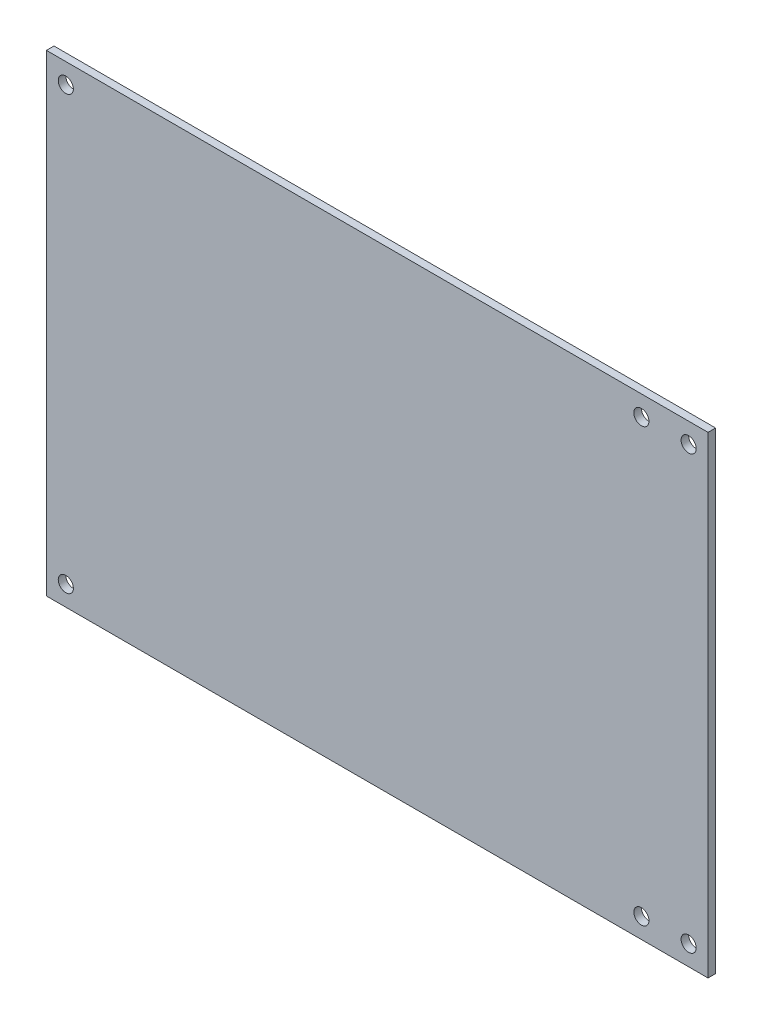
ISO-10303-21;
HEADER;
FILE_DESCRIPTION(('STEP AP214'),'2;1');
FILE_NAME('part.step','',(''),(''),'','','');
FILE_SCHEMA(('AUTOMOTIVE_DESIGN { 1 0 10303 214 1 1 1 1 }'));
ENDSEC;
DATA;
#1=APPLICATION_CONTEXT('core data for automotive mechanical design processes');
#2=APPLICATION_PROTOCOL_DEFINITION('international standard','automotive_design',2000,#1);
#3=PRODUCT_CONTEXT('',#1,'mechanical');
#4=PRODUCT('Part','Part','',(#3));
#5=PRODUCT_RELATED_PRODUCT_CATEGORY('part','',(#4));
#6=PRODUCT_DEFINITION_FORMATION('','',#4);
#7=PRODUCT_DEFINITION_CONTEXT('part definition',#1,'design');
#8=PRODUCT_DEFINITION('design','',#6,#7);
#9=PRODUCT_DEFINITION_SHAPE('','',#8);
#10=(LENGTH_UNIT() NAMED_UNIT(*) SI_UNIT(.MILLI.,.METRE.));
#11=(NAMED_UNIT(*) PLANE_ANGLE_UNIT() SI_UNIT($,.RADIAN.));
#12=(NAMED_UNIT(*) SI_UNIT($,.STERADIAN.) SOLID_ANGLE_UNIT());
#13=UNCERTAINTY_MEASURE_WITH_UNIT(LENGTH_MEASURE(1.E-05),#10,'distance_accuracy_value','');
#14=(GEOMETRIC_REPRESENTATION_CONTEXT(3) GLOBAL_UNCERTAINTY_ASSIGNED_CONTEXT((#13)) GLOBAL_UNIT_ASSIGNED_CONTEXT((#10,
#11,#12)) REPRESENTATION_CONTEXT('',''));
#15=CARTESIAN_POINT('',(0.,0.,0.));
#16=DIRECTION('',(0.,0.,1.));
#17=DIRECTION('',(1.,0.,0.));
#18=AXIS2_PLACEMENT_3D('',#15,#16,#17);
#19=CARTESIAN_POINT('',(70.,50.,1.6));
#20=DIRECTION('',(-1.,0.,0.));
#21=DIRECTION('',(0.,-1.,0.));
#22=AXIS2_PLACEMENT_3D('',#19,#20,#21);
#23=PLANE('',#22);
#24=DIRECTION('',(0.,1.,0.));
#25=VECTOR('',#24,1.);
#26=CARTESIAN_POINT('',(70.,50.,0.));
#27=LINE('',#26,#25);
#28=CARTESIAN_POINT('',(70.,-50.,0.));
#29=VERTEX_POINT('',#28);
#30=CARTESIAN_POINT('',(70.,50.,0.));
#31=VERTEX_POINT('',#30);
#32=EDGE_CURVE('E98',#29,#31,#27,.T.);
#33=ORIENTED_EDGE('',*,*,#32,.T.);
#34=DIRECTION('',(0.,0.,-1.));
#35=VECTOR('',#34,1.);
#36=CARTESIAN_POINT('',(70.,50.,1.6));
#37=LINE('',#36,#35);
#38=CARTESIAN_POINT('',(70.,50.,1.6));
#39=VERTEX_POINT('',#38);
#40=EDGE_CURVE('E11',#39,#31,#37,.T.);
#41=ORIENTED_EDGE('',*,*,#40,.F.);
#42=DIRECTION('',(0.,1.,0.));
#43=VECTOR('',#42,1.);
#44=CARTESIAN_POINT('',(70.,50.,1.6));
#45=LINE('',#44,#43);
#46=CARTESIAN_POINT('',(70.,-50.,1.6));
#47=VERTEX_POINT('',#46);
#48=EDGE_CURVE('E86',#47,#39,#45,.T.);
#49=ORIENTED_EDGE('',*,*,#48,.F.);
#50=DIRECTION('',(0.,0.,-1.));
#51=VECTOR('',#50,1.);
#52=CARTESIAN_POINT('',(70.,-50.,1.6));
#53=LINE('',#52,#51);
#54=EDGE_CURVE('E94',#47,#29,#53,.T.);
#55=ORIENTED_EDGE('',*,*,#54,.T.);
#56=EDGE_LOOP('',(#33,#41,#49,#55));
#57=FACE_BOUND('',#56,.T.);
#58=ADVANCED_FACE('F35',(#57),#23,.F.);
#59=CARTESIAN_POINT('',(-70.,50.,1.6));
#60=DIRECTION('',(0.,-1.,0.));
#61=DIRECTION('',(0.,0.,-1.));
#62=AXIS2_PLACEMENT_3D('',#59,#60,#61);
#63=PLANE('',#62);
#64=DIRECTION('',(-1.,0.,0.));
#65=VECTOR('',#64,1.);
#66=CARTESIAN_POINT('',(-70.,50.,0.));
#67=LINE('',#66,#65);
#68=CARTESIAN_POINT('',(-70.,50.,0.));
#69=VERTEX_POINT('',#68);
#70=EDGE_CURVE('E90',#31,#69,#67,.T.);
#71=ORIENTED_EDGE('',*,*,#70,.T.);
#72=DIRECTION('',(0.,0.,-1.));
#73=VECTOR('',#72,1.);
#74=CARTESIAN_POINT('',(-70.,50.,1.6));
#75=LINE('',#74,#73);
#76=CARTESIAN_POINT('',(-70.,50.,1.6));
#77=VERTEX_POINT('',#76);
#78=EDGE_CURVE('E43',#77,#69,#75,.T.);
#79=ORIENTED_EDGE('',*,*,#78,.F.);
#80=DIRECTION('',(-1.,0.,0.));
#81=VECTOR('',#80,1.);
#82=CARTESIAN_POINT('',(-70.,50.,1.6));
#83=LINE('',#82,#81);
#84=EDGE_CURVE('E81',#39,#77,#83,.T.);
#85=ORIENTED_EDGE('',*,*,#84,.F.);
#86=ORIENTED_EDGE('',*,*,#40,.T.);
#87=EDGE_LOOP('',(#71,#79,#85,#86));
#88=FACE_BOUND('',#87,.T.);
#89=ADVANCED_FACE('F89',(#88),#63,.F.);
#90=CARTESIAN_POINT('',(-70.,50.,1.6));
#91=DIRECTION('',(1.,0.,0.));
#92=DIRECTION('',(0.,1.,0.));
#93=AXIS2_PLACEMENT_3D('',#90,#91,#92);
#94=PLANE('',#93);
#95=DIRECTION('',(0.,-1.,0.));
#96=VECTOR('',#95,1.);
#97=CARTESIAN_POINT('',(-70.,50.,0.));
#98=LINE('',#97,#96);
#99=CARTESIAN_POINT('',(-70.,-50.,0.));
#100=VERTEX_POINT('',#99);
#101=EDGE_CURVE('E68',#69,#100,#98,.T.);
#102=ORIENTED_EDGE('',*,*,#101,.T.);
#103=DIRECTION('',(0.,0.,-1.));
#104=VECTOR('',#103,1.);
#105=CARTESIAN_POINT('',(-70.,-50.,1.6));
#106=LINE('',#105,#104);
#107=CARTESIAN_POINT('',(-70.,-50.,1.6));
#108=VERTEX_POINT('',#107);
#109=EDGE_CURVE('E91',#108,#100,#106,.T.);
#110=ORIENTED_EDGE('',*,*,#109,.F.);
#111=DIRECTION('',(0.,-1.,0.));
#112=VECTOR('',#111,1.);
#113=CARTESIAN_POINT('',(-70.,50.,1.6));
#114=LINE('',#113,#112);
#115=EDGE_CURVE('E84',#77,#108,#114,.T.);
#116=ORIENTED_EDGE('',*,*,#115,.F.);
#117=ORIENTED_EDGE('',*,*,#78,.T.);
#118=EDGE_LOOP('',(#102,#110,#116,#117));
#119=FACE_BOUND('',#118,.T.);
#120=ADVANCED_FACE('F92',(#119),#94,.F.);
#121=CARTESIAN_POINT('',(-70.,-50.,1.6));
#122=DIRECTION('',(0.,1.,0.));
#123=DIRECTION('',(0.,0.,1.));
#124=AXIS2_PLACEMENT_3D('',#121,#122,#123);
#125=PLANE('',#124);
#126=DIRECTION('',(1.,0.,0.));
#127=VECTOR('',#126,1.);
#128=CARTESIAN_POINT('',(-70.,-50.,0.));
#129=LINE('',#128,#127);
#130=EDGE_CURVE('E74',#100,#29,#129,.T.);
#131=ORIENTED_EDGE('',*,*,#130,.T.);
#132=ORIENTED_EDGE('',*,*,#54,.F.);
#133=DIRECTION('',(1.,0.,0.));
#134=VECTOR('',#133,1.);
#135=CARTESIAN_POINT('',(-70.,-50.,1.6));
#136=LINE('',#135,#134);
#137=EDGE_CURVE('E51',#108,#47,#136,.T.);
#138=ORIENTED_EDGE('',*,*,#137,.F.);
#139=ORIENTED_EDGE('',*,*,#109,.T.);
#140=EDGE_LOOP('',(#131,#132,#138,#139));
#141=FACE_BOUND('',#140,.T.);
#142=ADVANCED_FACE('F106',(#141),#125,.F.);
#143=CARTESIAN_POINT('',(0.,0.,1.6));
#144=DIRECTION('',(0.,0.,1.));
#145=DIRECTION('',(1.,0.,0.));
#146=AXIS2_PLACEMENT_3D('',#143,#144,#145);
#147=PLANE('',#146);
#148=CARTESIAN_POINT('',(55.9,-45.7500000000001,1.6));
#149=DIRECTION('',(0.,0.,1.));
#150=DIRECTION('',(1.,0.,0.));
#151=AXIS2_PLACEMENT_3D('',#148,#149,#150);
#152=CIRCLE('',#151,1.60000000000001);
#153=CARTESIAN_POINT('',(57.5,-45.7500000000001,1.6));
#154=VERTEX_POINT('',#153);
#155=EDGE_CURVE('E142',#154,#154,#152,.T.);
#156=ORIENTED_EDGE('',*,*,#155,.F.);
#157=EDGE_LOOP('',(#156));
#158=FACE_BOUND('',#157,.T.);
#159=CARTESIAN_POINT('',(55.9,45.7499999999999,1.6));
#160=DIRECTION('',(0.,0.,1.));
#161=DIRECTION('',(-1.,0.,0.));
#162=AXIS2_PLACEMENT_3D('',#159,#160,#161);
#163=CIRCLE('',#162,1.60000000000001);
#164=CARTESIAN_POINT('',(54.3,45.7499999999999,1.6));
#165=VERTEX_POINT('',#164);
#166=EDGE_CURVE('E136',#165,#165,#163,.T.);
#167=ORIENTED_EDGE('',*,*,#166,.F.);
#168=EDGE_LOOP('',(#167));
#169=FACE_BOUND('',#168,.T.);
#170=CARTESIAN_POINT('',(-65.9,-45.75,1.6));
#171=DIRECTION('',(0.,0.,1.));
#172=DIRECTION('',(-1.,0.,0.));
#173=AXIS2_PLACEMENT_3D('',#170,#171,#172);
#174=CIRCLE('',#173,1.60000000000001);
#175=CARTESIAN_POINT('',(-67.5,-45.75,1.6));
#176=VERTEX_POINT('',#175);
#177=EDGE_CURVE('E130',#176,#176,#174,.T.);
#178=ORIENTED_EDGE('',*,*,#177,.F.);
#179=EDGE_LOOP('',(#178));
#180=FACE_BOUND('',#179,.T.);
#181=CARTESIAN_POINT('',(65.9,-45.75,1.6));
#182=DIRECTION('',(0.,0.,1.));
#183=DIRECTION('',(1.,0.,0.));
#184=AXIS2_PLACEMENT_3D('',#181,#182,#183);
#185=CIRCLE('',#184,1.60000000000001);
#186=CARTESIAN_POINT('',(67.5,-45.75,1.6));
#187=VERTEX_POINT('',#186);
#188=EDGE_CURVE('E124',#187,#187,#185,.T.);
#189=ORIENTED_EDGE('',*,*,#188,.F.);
#190=EDGE_LOOP('',(#189));
#191=FACE_BOUND('',#190,.T.);
#192=CARTESIAN_POINT('',(65.9,45.75,1.6));
#193=DIRECTION('',(0.,0.,1.));
#194=DIRECTION('',(-1.,0.,0.));
#195=AXIS2_PLACEMENT_3D('',#192,#193,#194);
#196=CIRCLE('',#195,1.60000000000001);
#197=CARTESIAN_POINT('',(64.3,45.75,1.6));
#198=VERTEX_POINT('',#197);
#199=EDGE_CURVE('E118',#198,#198,#196,.T.);
#200=ORIENTED_EDGE('',*,*,#199,.F.);
#201=EDGE_LOOP('',(#200));
#202=FACE_BOUND('',#201,.T.);
#203=CARTESIAN_POINT('',(-65.9,45.75,1.6));
#204=DIRECTION('',(0.,0.,1.));
#205=DIRECTION('',(1.,0.,0.));
#206=AXIS2_PLACEMENT_3D('',#203,#204,#205);
#207=CIRCLE('',#206,1.60000000000001);
#208=CARTESIAN_POINT('',(-64.3,45.75,1.6));
#209=VERTEX_POINT('',#208);
#210=EDGE_CURVE('E112',#209,#209,#207,.T.);
#211=ORIENTED_EDGE('',*,*,#210,.F.);
#212=EDGE_LOOP('',(#211));
#213=FACE_BOUND('',#212,.T.);
#214=ORIENTED_EDGE('',*,*,#48,.T.);
#215=ORIENTED_EDGE('',*,*,#84,.T.);
#216=ORIENTED_EDGE('',*,*,#115,.T.);
#217=ORIENTED_EDGE('',*,*,#137,.T.);
#218=EDGE_LOOP('',(#214,#215,#216,#217));
#219=FACE_BOUND('',#218,.T.);
#220=ADVANCED_FACE('F82',(#158,#169,#180,#191,#202,#213,#219),#147,.T.);
#221=CARTESIAN_POINT('',(0.,0.,0.));
#222=DIRECTION('',(0.,0.,1.));
#223=DIRECTION('',(1.,0.,0.));
#224=AXIS2_PLACEMENT_3D('',#221,#222,#223);
#225=PLANE('',#224);
#226=CARTESIAN_POINT('',(55.9,-45.7500000000001,0.));
#227=DIRECTION('',(0.,0.,1.));
#228=DIRECTION('',(1.,0.,0.));
#229=AXIS2_PLACEMENT_3D('',#226,#227,#228);
#230=CIRCLE('',#229,1.60000000000001);
#231=CARTESIAN_POINT('',(57.5,-45.7500000000001,0.));
#232=VERTEX_POINT('',#231);
#233=EDGE_CURVE('E139',#232,#232,#230,.T.);
#234=ORIENTED_EDGE('',*,*,#233,.T.);
#235=EDGE_LOOP('',(#234));
#236=FACE_BOUND('',#235,.T.);
#237=CARTESIAN_POINT('',(55.9,45.7499999999999,0.));
#238=DIRECTION('',(0.,0.,1.));
#239=DIRECTION('',(-1.,0.,0.));
#240=AXIS2_PLACEMENT_3D('',#237,#238,#239);
#241=CIRCLE('',#240,1.60000000000001);
#242=CARTESIAN_POINT('',(54.3,45.7499999999999,0.));
#243=VERTEX_POINT('',#242);
#244=EDGE_CURVE('E133',#243,#243,#241,.T.);
#245=ORIENTED_EDGE('',*,*,#244,.T.);
#246=EDGE_LOOP('',(#245));
#247=FACE_BOUND('',#246,.T.);
#248=CARTESIAN_POINT('',(-65.9,-45.75,0.));
#249=DIRECTION('',(0.,0.,1.));
#250=DIRECTION('',(-1.,0.,0.));
#251=AXIS2_PLACEMENT_3D('',#248,#249,#250);
#252=CIRCLE('',#251,1.60000000000001);
#253=CARTESIAN_POINT('',(-67.5,-45.75,0.));
#254=VERTEX_POINT('',#253);
#255=EDGE_CURVE('E127',#254,#254,#252,.T.);
#256=ORIENTED_EDGE('',*,*,#255,.T.);
#257=EDGE_LOOP('',(#256));
#258=FACE_BOUND('',#257,.T.);
#259=CARTESIAN_POINT('',(65.9,-45.75,0.));
#260=DIRECTION('',(0.,0.,1.));
#261=DIRECTION('',(1.,0.,0.));
#262=AXIS2_PLACEMENT_3D('',#259,#260,#261);
#263=CIRCLE('',#262,1.60000000000001);
#264=CARTESIAN_POINT('',(67.5,-45.75,0.));
#265=VERTEX_POINT('',#264);
#266=EDGE_CURVE('E121',#265,#265,#263,.T.);
#267=ORIENTED_EDGE('',*,*,#266,.T.);
#268=EDGE_LOOP('',(#267));
#269=FACE_BOUND('',#268,.T.);
#270=CARTESIAN_POINT('',(65.9,45.75,0.));
#271=DIRECTION('',(0.,0.,1.));
#272=DIRECTION('',(-1.,0.,0.));
#273=AXIS2_PLACEMENT_3D('',#270,#271,#272);
#274=CIRCLE('',#273,1.60000000000001);
#275=CARTESIAN_POINT('',(64.3,45.75,0.));
#276=VERTEX_POINT('',#275);
#277=EDGE_CURVE('E115',#276,#276,#274,.T.);
#278=ORIENTED_EDGE('',*,*,#277,.T.);
#279=EDGE_LOOP('',(#278));
#280=FACE_BOUND('',#279,.T.);
#281=CARTESIAN_POINT('',(-65.9,45.75,0.));
#282=DIRECTION('',(0.,0.,1.));
#283=DIRECTION('',(1.,0.,0.));
#284=AXIS2_PLACEMENT_3D('',#281,#282,#283);
#285=CIRCLE('',#284,1.60000000000001);
#286=CARTESIAN_POINT('',(-64.3,45.75,0.));
#287=VERTEX_POINT('',#286);
#288=EDGE_CURVE('E101',#287,#287,#285,.T.);
#289=ORIENTED_EDGE('',*,*,#288,.T.);
#290=EDGE_LOOP('',(#289));
#291=FACE_BOUND('',#290,.T.);
#292=ORIENTED_EDGE('',*,*,#32,.F.);
#293=ORIENTED_EDGE('',*,*,#130,.F.);
#294=ORIENTED_EDGE('',*,*,#101,.F.);
#295=ORIENTED_EDGE('',*,*,#70,.F.);
#296=EDGE_LOOP('',(#292,#293,#294,#295));
#297=FACE_BOUND('',#296,.T.);
#298=ADVANCED_FACE('F109',(#236,#247,#258,#269,#280,#291,#297),#225,.F.);
#299=CARTESIAN_POINT('',(-65.9,45.75,0.));
#300=DIRECTION('',(0.,0.,1.));
#301=DIRECTION('',(1.,0.,0.));
#302=AXIS2_PLACEMENT_3D('',#299,#300,#301);
#303=CYLINDRICAL_SURFACE('',#302,1.60000000000001);
#304=ORIENTED_EDGE('',*,*,#288,.F.);
#305=EDGE_LOOP('',(#304));
#306=FACE_BOUND('',#305,.T.);
#307=ORIENTED_EDGE('',*,*,#210,.T.);
#308=EDGE_LOOP('',(#307));
#309=FACE_BOUND('',#308,.T.);
#310=ADVANCED_FACE('F170',(#306,#309),#303,.F.);
#311=CARTESIAN_POINT('',(65.9,45.75,0.));
#312=DIRECTION('',(0.,0.,1.));
#313=DIRECTION('',(1.,0.,0.));
#314=AXIS2_PLACEMENT_3D('',#311,#312,#313);
#315=CYLINDRICAL_SURFACE('',#314,1.60000000000001);
#316=ORIENTED_EDGE('',*,*,#277,.F.);
#317=EDGE_LOOP('',(#316));
#318=FACE_BOUND('',#317,.T.);
#319=ORIENTED_EDGE('',*,*,#199,.T.);
#320=EDGE_LOOP('',(#319));
#321=FACE_BOUND('',#320,.T.);
#322=ADVANCED_FACE('F172',(#318,#321),#315,.F.);
#323=CARTESIAN_POINT('',(65.9,-45.75,0.));
#324=DIRECTION('',(0.,0.,1.));
#325=DIRECTION('',(1.,0.,0.));
#326=AXIS2_PLACEMENT_3D('',#323,#324,#325);
#327=CYLINDRICAL_SURFACE('',#326,1.60000000000001);
#328=ORIENTED_EDGE('',*,*,#266,.F.);
#329=EDGE_LOOP('',(#328));
#330=FACE_BOUND('',#329,.T.);
#331=ORIENTED_EDGE('',*,*,#188,.T.);
#332=EDGE_LOOP('',(#331));
#333=FACE_BOUND('',#332,.T.);
#334=ADVANCED_FACE('F179',(#330,#333),#327,.F.);
#335=CARTESIAN_POINT('',(-65.9,-45.75,0.));
#336=DIRECTION('',(0.,0.,1.));
#337=DIRECTION('',(1.,0.,0.));
#338=AXIS2_PLACEMENT_3D('',#335,#336,#337);
#339=CYLINDRICAL_SURFACE('',#338,1.60000000000001);
#340=ORIENTED_EDGE('',*,*,#255,.F.);
#341=EDGE_LOOP('',(#340));
#342=FACE_BOUND('',#341,.T.);
#343=ORIENTED_EDGE('',*,*,#177,.T.);
#344=EDGE_LOOP('',(#343));
#345=FACE_BOUND('',#344,.T.);
#346=ADVANCED_FACE('F225',(#342,#345),#339,.F.);
#347=CARTESIAN_POINT('',(55.9,45.7499999999999,0.));
#348=DIRECTION('',(0.,0.,1.));
#349=DIRECTION('',(1.,0.,0.));
#350=AXIS2_PLACEMENT_3D('',#347,#348,#349);
#351=CYLINDRICAL_SURFACE('',#350,1.60000000000001);
#352=ORIENTED_EDGE('',*,*,#244,.F.);
#353=EDGE_LOOP('',(#352));
#354=FACE_BOUND('',#353,.T.);
#355=ORIENTED_EDGE('',*,*,#166,.T.);
#356=EDGE_LOOP('',(#355));
#357=FACE_BOUND('',#356,.T.);
#358=ADVANCED_FACE('F153',(#354,#357),#351,.F.);
#359=CARTESIAN_POINT('',(55.9,-45.7500000000001,0.));
#360=DIRECTION('',(0.,0.,1.));
#361=DIRECTION('',(1.,0.,0.));
#362=AXIS2_PLACEMENT_3D('',#359,#360,#361);
#363=CYLINDRICAL_SURFACE('',#362,1.60000000000001);
#364=ORIENTED_EDGE('',*,*,#233,.F.);
#365=EDGE_LOOP('',(#364));
#366=FACE_BOUND('',#365,.T.);
#367=ORIENTED_EDGE('',*,*,#155,.T.);
#368=EDGE_LOOP('',(#367));
#369=FACE_BOUND('',#368,.T.);
#370=ADVANCED_FACE('F150',(#366,#369),#363,.F.);
#371=CLOSED_SHELL('',(#58,#89,#120,#142,#220,#298,#310,#322,#334,#346,#358,#370));
#372=MANIFOLD_SOLID_BREP('B2',#371);
#373=ADVANCED_BREP_SHAPE_REPRESENTATION('',(#18,#372),#14);
#374=SHAPE_DEFINITION_REPRESENTATION(#9,#373);
ENDSEC;
END-ISO-10303-21;
